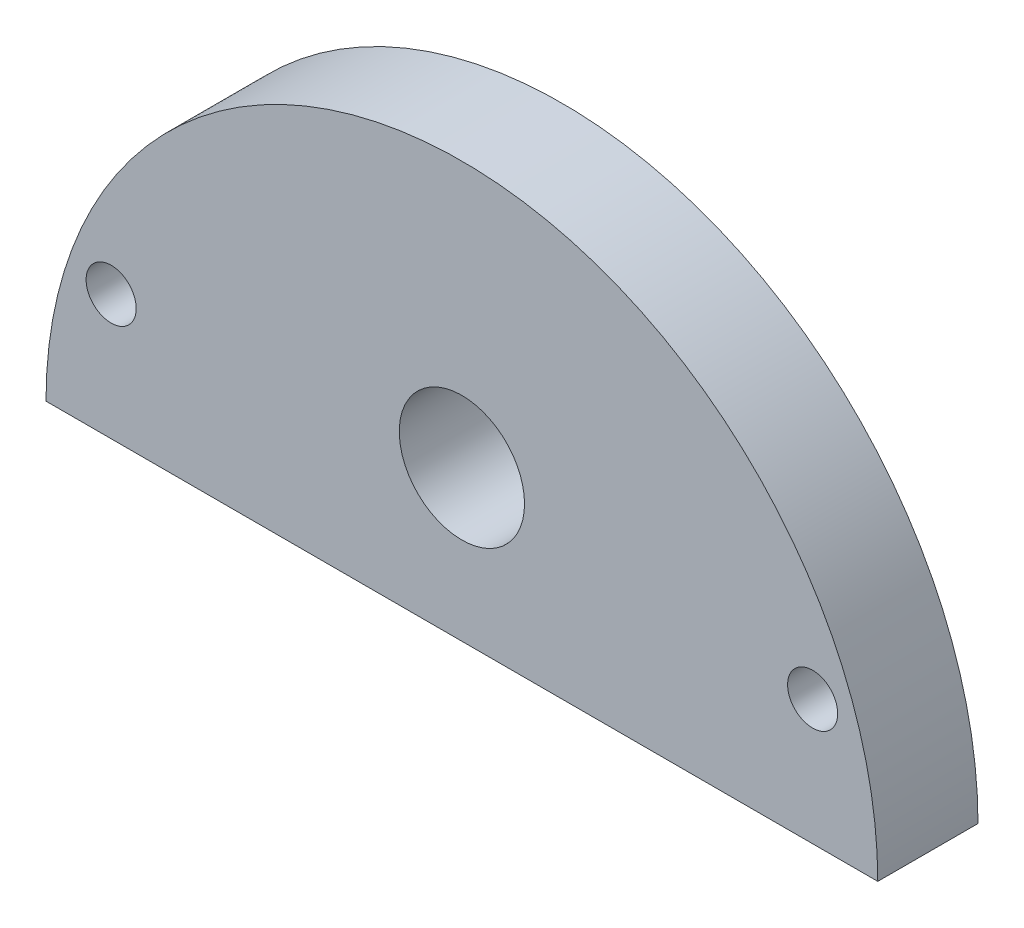
ISO-10303-21;
HEADER;
FILE_DESCRIPTION(('STEP AP214'),'2;1');
FILE_NAME('part.step','',(''),(''),'','','');
FILE_SCHEMA(('AUTOMOTIVE_DESIGN { 1 0 10303 214 1 1 1 1 }'));
ENDSEC;
DATA;
#1=APPLICATION_CONTEXT('core data for automotive mechanical design processes');
#2=APPLICATION_PROTOCOL_DEFINITION('international standard','automotive_design',2000,#1);
#3=PRODUCT_CONTEXT('',#1,'mechanical');
#4=PRODUCT('Part','Part','',(#3));
#5=PRODUCT_RELATED_PRODUCT_CATEGORY('part','',(#4));
#6=PRODUCT_DEFINITION_FORMATION('','',#4);
#7=PRODUCT_DEFINITION_CONTEXT('part definition',#1,'design');
#8=PRODUCT_DEFINITION('design','',#6,#7);
#9=PRODUCT_DEFINITION_SHAPE('','',#8);
#10=(LENGTH_UNIT() NAMED_UNIT(*) SI_UNIT(.MILLI.,.METRE.));
#11=(NAMED_UNIT(*) PLANE_ANGLE_UNIT() SI_UNIT($,.RADIAN.));
#12=(NAMED_UNIT(*) SI_UNIT($,.STERADIAN.) SOLID_ANGLE_UNIT());
#13=UNCERTAINTY_MEASURE_WITH_UNIT(LENGTH_MEASURE(1.E-05),#10,'distance_accuracy_value','');
#14=(GEOMETRIC_REPRESENTATION_CONTEXT(3) GLOBAL_UNCERTAINTY_ASSIGNED_CONTEXT((#13)) GLOBAL_UNIT_ASSIGNED_CONTEXT((#10,
#11,#12)) REPRESENTATION_CONTEXT('',''));
#15=CARTESIAN_POINT('',(0.,0.,0.));
#16=DIRECTION('',(0.,0.,1.));
#17=DIRECTION('',(1.,0.,0.));
#18=AXIS2_PLACEMENT_3D('',#15,#16,#17);
#19=CARTESIAN_POINT('',(0.,0.,8.));
#20=DIRECTION('',(0.,0.,1.));
#21=DIRECTION('',(1.,0.,0.));
#22=AXIS2_PLACEMENT_3D('',#19,#20,#21);
#23=PLANE('',#22);
#24=CARTESIAN_POINT('',(-28.,10.,8.));
#25=DIRECTION('',(0.,0.,1.));
#26=DIRECTION('',(1.,0.,0.));
#27=AXIS2_PLACEMENT_3D('',#24,#25,#26);
#28=CIRCLE('',#27,2.);
#29=CARTESIAN_POINT('',(-26.,10.,8.));
#30=VERTEX_POINT('',#29);
#31=EDGE_CURVE('E89',#30,#30,#28,.T.);
#32=ORIENTED_EDGE('',*,*,#31,.F.);
#33=EDGE_LOOP('',(#32));
#34=FACE_BOUND('',#33,.T.);
#35=CARTESIAN_POINT('',(28.,10.,8.));
#36=DIRECTION('',(0.,0.,1.));
#37=DIRECTION('',(1.,0.,0.));
#38=AXIS2_PLACEMENT_3D('',#35,#36,#37);
#39=CIRCLE('',#38,2.);
#40=CARTESIAN_POINT('',(30.,10.,8.));
#41=VERTEX_POINT('',#40);
#42=EDGE_CURVE('E83',#41,#41,#39,.T.);
#43=ORIENTED_EDGE('',*,*,#42,.F.);
#44=EDGE_LOOP('',(#43));
#45=FACE_BOUND('',#44,.T.);
#46=CARTESIAN_POINT('',(0.,0.,8.));
#47=DIRECTION('',(0.,0.,1.));
#48=DIRECTION('',(1.,0.,0.));
#49=AXIS2_PLACEMENT_3D('',#46,#47,#48);
#50=CIRCLE('',#49,33.201361832184);
#51=CARTESIAN_POINT('',(33.201361832184,0.,8.));
#52=VERTEX_POINT('',#51);
#53=CARTESIAN_POINT('',(-33.201361832184,0.,8.));
#54=VERTEX_POINT('',#53);
#55=EDGE_CURVE('E66',#52,#54,#50,.T.);
#56=ORIENTED_EDGE('',*,*,#55,.T.);
#57=DIRECTION('',(1.,0.,0.));
#58=VECTOR('',#57,1.);
#59=CARTESIAN_POINT('',(-33.201361832184,0.,8.));
#60=LINE('',#59,#58);
#61=EDGE_CURVE('E51',#54,#52,#60,.T.);
#62=ORIENTED_EDGE('',*,*,#61,.T.);
#63=EDGE_LOOP('',(#56,#62));
#64=FACE_BOUND('',#63,.T.);
#65=CARTESIAN_POINT('',(0.,12.,8.));
#66=DIRECTION('',(0.,0.,1.));
#67=DIRECTION('',(1.,0.,0.));
#68=AXIS2_PLACEMENT_3D('',#65,#66,#67);
#69=CIRCLE('',#68,5.);
#70=CARTESIAN_POINT('',(5.,12.,8.));
#71=VERTEX_POINT('',#70);
#72=EDGE_CURVE('E72',#71,#71,#69,.T.);
#73=ORIENTED_EDGE('',*,*,#72,.F.);
#74=EDGE_LOOP('',(#73));
#75=FACE_BOUND('',#74,.T.);
#76=ADVANCED_FACE('F35',(#34,#45,#64,#75),#23,.T.);
#77=CARTESIAN_POINT('',(0.,0.,0.));
#78=DIRECTION('',(0.,0.,1.));
#79=DIRECTION('',(1.,0.,0.));
#80=AXIS2_PLACEMENT_3D('',#77,#78,#79);
#81=PLANE('',#80);
#82=CARTESIAN_POINT('',(-28.,10.,0.));
#83=DIRECTION('',(0.,0.,1.));
#84=DIRECTION('',(1.,0.,0.));
#85=AXIS2_PLACEMENT_3D('',#82,#83,#84);
#86=CIRCLE('',#85,2.);
#87=CARTESIAN_POINT('',(-26.,10.,0.));
#88=VERTEX_POINT('',#87);
#89=EDGE_CURVE('E81',#88,#88,#86,.T.);
#90=ORIENTED_EDGE('',*,*,#89,.T.);
#91=EDGE_LOOP('',(#90));
#92=FACE_BOUND('',#91,.T.);
#93=CARTESIAN_POINT('',(28.,10.,0.));
#94=DIRECTION('',(0.,0.,1.));
#95=DIRECTION('',(1.,0.,0.));
#96=AXIS2_PLACEMENT_3D('',#93,#94,#95);
#97=CIRCLE('',#96,2.);
#98=CARTESIAN_POINT('',(30.,10.,0.));
#99=VERTEX_POINT('',#98);
#100=EDGE_CURVE('E86',#99,#99,#97,.T.);
#101=ORIENTED_EDGE('',*,*,#100,.T.);
#102=EDGE_LOOP('',(#101));
#103=FACE_BOUND('',#102,.T.);
#104=CARTESIAN_POINT('',(0.,0.,0.));
#105=DIRECTION('',(0.,0.,1.));
#106=DIRECTION('',(1.,0.,0.));
#107=AXIS2_PLACEMENT_3D('',#104,#105,#106);
#108=CIRCLE('',#107,33.201361832184);
#109=CARTESIAN_POINT('',(33.201361832184,0.,0.));
#110=VERTEX_POINT('',#109);
#111=CARTESIAN_POINT('',(-33.201361832184,0.,0.));
#112=VERTEX_POINT('',#111);
#113=EDGE_CURVE('E67',#110,#112,#108,.T.);
#114=ORIENTED_EDGE('',*,*,#113,.F.);
#115=DIRECTION('',(1.,0.,0.));
#116=VECTOR('',#115,1.);
#117=CARTESIAN_POINT('',(-33.201361832184,0.,0.));
#118=LINE('',#117,#116);
#119=EDGE_CURVE('E59',#112,#110,#118,.T.);
#120=ORIENTED_EDGE('',*,*,#119,.F.);
#121=EDGE_LOOP('',(#114,#120));
#122=FACE_BOUND('',#121,.T.);
#123=CARTESIAN_POINT('',(0.,12.,0.));
#124=DIRECTION('',(0.,0.,1.));
#125=DIRECTION('',(1.,0.,0.));
#126=AXIS2_PLACEMENT_3D('',#123,#124,#125);
#127=CIRCLE('',#126,5.);
#128=CARTESIAN_POINT('',(5.,12.,0.));
#129=VERTEX_POINT('',#128);
#130=EDGE_CURVE('E75',#129,#129,#127,.T.);
#131=ORIENTED_EDGE('',*,*,#130,.T.);
#132=EDGE_LOOP('',(#131));
#133=FACE_BOUND('',#132,.T.);
#134=ADVANCED_FACE('F70',(#92,#103,#122,#133),#81,.F.);
#135=CARTESIAN_POINT('',(0.,0.,8.));
#136=DIRECTION('',(0.,0.,-1.));
#137=DIRECTION('',(-1.,0.,0.));
#138=AXIS2_PLACEMENT_3D('',#135,#136,#137);
#139=CYLINDRICAL_SURFACE('',#138,33.201361832184);
#140=ORIENTED_EDGE('',*,*,#113,.T.);
#141=DIRECTION('',(0.,0.,-1.));
#142=VECTOR('',#141,1.);
#143=CARTESIAN_POINT('',(-33.201361832184,0.,8.));
#144=LINE('',#143,#142);
#145=EDGE_CURVE('E11',#54,#112,#144,.T.);
#146=ORIENTED_EDGE('',*,*,#145,.F.);
#147=ORIENTED_EDGE('',*,*,#55,.F.);
#148=DIRECTION('',(0.,0.,-1.));
#149=VECTOR('',#148,1.);
#150=CARTESIAN_POINT('',(33.201361832184,0.,8.));
#151=LINE('',#150,#149);
#152=EDGE_CURVE('E44',#52,#110,#151,.T.);
#153=ORIENTED_EDGE('',*,*,#152,.T.);
#154=EDGE_LOOP('',(#140,#146,#147,#153));
#155=FACE_BOUND('',#154,.T.);
#156=ADVANCED_FACE('F37',(#155),#139,.T.);
#157=CARTESIAN_POINT('',(-33.201361832184,0.,8.));
#158=DIRECTION('',(0.,1.,0.));
#159=DIRECTION('',(0.,0.,1.));
#160=AXIS2_PLACEMENT_3D('',#157,#158,#159);
#161=PLANE('',#160);
#162=ORIENTED_EDGE('',*,*,#119,.T.);
#163=ORIENTED_EDGE('',*,*,#152,.F.);
#164=ORIENTED_EDGE('',*,*,#61,.F.);
#165=ORIENTED_EDGE('',*,*,#145,.T.);
#166=EDGE_LOOP('',(#162,#163,#164,#165));
#167=FACE_BOUND('',#166,.T.);
#168=ADVANCED_FACE('F62',(#167),#161,.F.);
#169=CARTESIAN_POINT('',(0.,12.,8.));
#170=DIRECTION('',(0.,0.,-1.));
#171=DIRECTION('',(-1.,0.,0.));
#172=AXIS2_PLACEMENT_3D('',#169,#170,#171);
#173=CYLINDRICAL_SURFACE('',#172,5.);
#174=ORIENTED_EDGE('',*,*,#72,.T.);
#175=EDGE_LOOP('',(#174));
#176=FACE_BOUND('',#175,.T.);
#177=ORIENTED_EDGE('',*,*,#130,.F.);
#178=EDGE_LOOP('',(#177));
#179=FACE_BOUND('',#178,.T.);
#180=ADVANCED_FACE('F111',(#176,#179),#173,.F.);
#181=CARTESIAN_POINT('',(28.,10.,0.));
#182=DIRECTION('',(0.,0.,1.));
#183=DIRECTION('',(1.,0.,0.));
#184=AXIS2_PLACEMENT_3D('',#181,#182,#183);
#185=CYLINDRICAL_SURFACE('',#184,2.);
#186=ORIENTED_EDGE('',*,*,#100,.F.);
#187=EDGE_LOOP('',(#186));
#188=FACE_BOUND('',#187,.T.);
#189=ORIENTED_EDGE('',*,*,#42,.T.);
#190=EDGE_LOOP('',(#189));
#191=FACE_BOUND('',#190,.T.);
#192=ADVANCED_FACE('F100',(#188,#191),#185,.F.);
#193=CARTESIAN_POINT('',(-28.,10.,0.));
#194=DIRECTION('',(0.,0.,1.));
#195=DIRECTION('',(1.,0.,0.));
#196=AXIS2_PLACEMENT_3D('',#193,#194,#195);
#197=CYLINDRICAL_SURFACE('',#196,2.);
#198=ORIENTED_EDGE('',*,*,#89,.F.);
#199=EDGE_LOOP('',(#198));
#200=FACE_BOUND('',#199,.T.);
#201=ORIENTED_EDGE('',*,*,#31,.T.);
#202=EDGE_LOOP('',(#201));
#203=FACE_BOUND('',#202,.T.);
#204=ADVANCED_FACE('F97',(#200,#203),#197,.F.);
#205=CLOSED_SHELL('',(#76,#134,#156,#168,#180,#192,#204));
#206=MANIFOLD_SOLID_BREP('B2',#205);
#207=ADVANCED_BREP_SHAPE_REPRESENTATION('',(#18,#206),#14);
#208=SHAPE_DEFINITION_REPRESENTATION(#9,#207);
ENDSEC;
END-ISO-10303-21;
